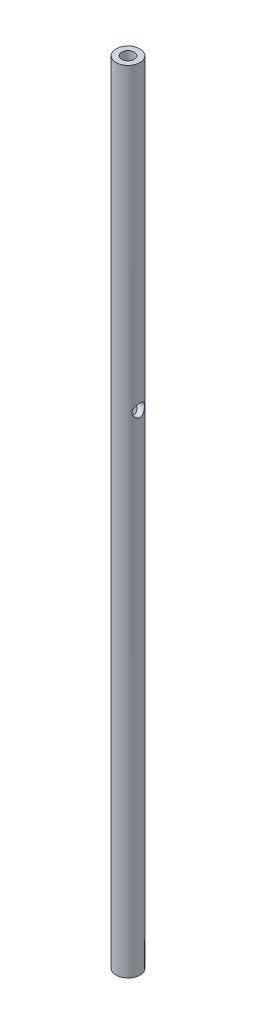
ISO-10303-21;
HEADER;
FILE_DESCRIPTION(('STEP AP214'),'2;1');
FILE_NAME('part.step','',(''),(''),'','','');
FILE_SCHEMA(('AUTOMOTIVE_DESIGN { 1 0 10303 214 1 1 1 1 }'));
ENDSEC;
DATA;
#1=APPLICATION_CONTEXT('core data for automotive mechanical design processes');
#2=APPLICATION_PROTOCOL_DEFINITION('international standard','automotive_design',2000,#1);
#3=PRODUCT_CONTEXT('',#1,'mechanical');
#4=PRODUCT('Part','Part','',(#3));
#5=PRODUCT_RELATED_PRODUCT_CATEGORY('part','',(#4));
#6=PRODUCT_DEFINITION_FORMATION('','',#4);
#7=PRODUCT_DEFINITION_CONTEXT('part definition',#1,'design');
#8=PRODUCT_DEFINITION('design','',#6,#7);
#9=PRODUCT_DEFINITION_SHAPE('','',#8);
#10=(LENGTH_UNIT() NAMED_UNIT(*) SI_UNIT(.MILLI.,.METRE.));
#11=(NAMED_UNIT(*) PLANE_ANGLE_UNIT() SI_UNIT($,.RADIAN.));
#12=(NAMED_UNIT(*) SI_UNIT($,.STERADIAN.) SOLID_ANGLE_UNIT());
#13=UNCERTAINTY_MEASURE_WITH_UNIT(LENGTH_MEASURE(1.E-05),#10,'distance_accuracy_value','');
#14=(GEOMETRIC_REPRESENTATION_CONTEXT(3) GLOBAL_UNCERTAINTY_ASSIGNED_CONTEXT((#13)) GLOBAL_UNIT_ASSIGNED_CONTEXT((#10,
#11,#12)) REPRESENTATION_CONTEXT('',''));
#15=CARTESIAN_POINT('',(0.,0.,0.));
#16=DIRECTION('',(0.,0.,1.));
#17=DIRECTION('',(1.,0.,0.));
#18=AXIS2_PLACEMENT_3D('',#15,#16,#17);
#19=CARTESIAN_POINT('',(0.,-630.,0.));
#20=DIRECTION('',(0.,1.,0.));
#21=DIRECTION('',(-1.,0.,0.));
#22=AXIS2_PLACEMENT_3D('',#19,#20,#21);
#23=CYLINDRICAL_SURFACE('',#22,5.);
#24=CARTESIAN_POINT('',(0.,0.,0.));
#25=DIRECTION('',(0.,1.,0.));
#26=DIRECTION('',(0.,0.,1.));
#27=AXIS2_PLACEMENT_3D('',#24,#25,#26);
#28=CIRCLE('',#27,5.);
#29=CARTESIAN_POINT('',(0.,0.,5.));
#30=VERTEX_POINT('',#29);
#31=EDGE_CURVE('E73',#30,#30,#28,.T.);
#32=ORIENTED_EDGE('',*,*,#31,.T.);
#33=EDGE_LOOP('',(#32));
#34=FACE_BOUND('',#33,.T.);
#35=CARTESIAN_POINT('',(0.,-240.,0.));
#36=DIRECTION('',(-0.707106781186548,0.707106781186547,0.));
#37=DIRECTION('',(0.707106781186547,0.707106781186548,0.));
#38=AXIS2_PLACEMENT_3D('',#35,#36,#37);
#39=ELLIPSE('',#38,7.07106781186548,5.);
#40=CARTESIAN_POINT('',(0.,-240.,-5.00000000000002));
#41=VERTEX_POINT('',#40);
#42=CARTESIAN_POINT('',(0.,-240.,4.99999999999999));
#43=VERTEX_POINT('',#42);
#44=EDGE_CURVE('E57',#41,#43,#39,.F.);
#45=ORIENTED_EDGE('',*,*,#44,.T.);
#46=CARTESIAN_POINT('',(0.,-240.,0.));
#47=DIRECTION('',(0.707106781186547,0.707106781186548,0.));
#48=DIRECTION('',(-0.707106781186548,0.707106781186547,0.));
#49=AXIS2_PLACEMENT_3D('',#46,#47,#48);
#50=ELLIPSE('',#49,7.07106781186548,5.);
#51=EDGE_CURVE('E65',#43,#41,#50,.F.);
#52=ORIENTED_EDGE('',*,*,#51,.T.);
#53=EDGE_LOOP('',(#45,#52));
#54=FACE_BOUND('',#53,.T.);
#55=ADVANCED_FACE('F39',(#34,#54),#23,.F.);
#56=CARTESIAN_POINT('',(0.,-240.,0.));
#57=DIRECTION('',(-0.707106781186548,0.707106781186547,0.));
#58=DIRECTION('',(0.707106781186547,0.707106781186548,0.));
#59=AXIS2_PLACEMENT_3D('',#56,#57,#58);
#60=ELLIPSE('',#59,7.07106781186548,5.);
#61=EDGE_CURVE('E63',#41,#43,#60,.T.);
#62=ORIENTED_EDGE('',*,*,#61,.T.);
#63=CARTESIAN_POINT('',(0.,-240.,0.));
#64=DIRECTION('',(0.707106781186547,0.707106781186548,0.));
#65=DIRECTION('',(-0.707106781186548,0.707106781186547,0.));
#66=AXIS2_PLACEMENT_3D('',#63,#64,#65);
#67=ELLIPSE('',#66,7.07106781186548,5.);
#68=EDGE_CURVE('E68',#43,#41,#67,.T.);
#69=ORIENTED_EDGE('',*,*,#68,.T.);
#70=EDGE_LOOP('',(#62,#69));
#71=FACE_BOUND('',#70,.T.);
#72=CARTESIAN_POINT('',(0.,-630.,0.));
#73=DIRECTION('',(0.,1.,0.));
#74=DIRECTION('',(0.,0.,1.));
#75=AXIS2_PLACEMENT_3D('',#72,#73,#74);
#76=CIRCLE('',#75,5.);
#77=CARTESIAN_POINT('',(0.,-630.,5.));
#78=VERTEX_POINT('',#77);
#79=EDGE_CURVE('E78',#78,#78,#76,.T.);
#80=ORIENTED_EDGE('',*,*,#79,.F.);
#81=EDGE_LOOP('',(#80));
#82=FACE_BOUND('',#81,.T.);
#83=ADVANCED_FACE('F41',(#71,#82),#23,.F.);
#84=CARTESIAN_POINT('',(0.,-630.,0.));
#85=DIRECTION('',(0.,1.,0.));
#86=DIRECTION('',(-1.,0.,0.));
#87=AXIS2_PLACEMENT_3D('',#84,#85,#86);
#88=CYLINDRICAL_SURFACE('',#87,9.5);
#89=CARTESIAN_POINT('',(-9.49999999999997,-245.,0.));
#90=CARTESIAN_POINT('',(-9.50000025830865,-245.000000317987,0.130642017435205));
#91=CARTESIAN_POINT('',(-9.49729937430299,-244.994874460909,0.261280381095527));
#92=CARTESIAN_POINT('',(-9.48656543983488,-244.974434606502,0.521584051797466));
#93=CARTESIAN_POINT('',(-9.47853045078798,-244.959116905127,0.651248987731433));
#94=CARTESIAN_POINT('',(-9.45732130010808,-244.918457771743,0.908724902304485));
#95=CARTESIAN_POINT('',(-9.44414105596155,-244.893104475561,1.03653350028886));
#96=CARTESIAN_POINT('',(-9.41296917939981,-244.832665747286,1.28927680532049));
#97=CARTESIAN_POINT('',(-9.39497558089874,-244.797576338115,1.41421031529786));
#98=CARTESIAN_POINT('',(-9.35470548168466,-244.718228407702,1.65978714859798));
#99=CARTESIAN_POINT('',(-9.33244851287116,-244.674011632829,1.78044717261644));
#100=CARTESIAN_POINT('',(-9.28411689570364,-244.576745504022,2.01738015491989));
#101=CARTESIAN_POINT('',(-9.2580408072228,-244.523692817172,2.13365143738956));
#102=CARTESIAN_POINT('',(-9.17495890241578,-244.352007064426,2.47482405857924));
#103=CARTESIAN_POINT('',(-9.1130560788389,-244.220763507552,2.69233753619867));
#104=CARTESIAN_POINT('',(-8.97711976393959,-243.91892513356,3.11677156857516));
#105=CARTESIAN_POINT('',(-8.90255958431836,-243.746328437928,3.3220871145033));
#106=CARTESIAN_POINT('',(-8.75125016006093,-243.371044573155,3.70237027252014));
#107=CARTESIAN_POINT('',(-8.67449911628702,-243.168332063022,3.87731205508639));
#108=CARTESIAN_POINT('',(-8.51958772864531,-242.716981146188,4.20746485864962));
#109=CARTESIAN_POINT('',(-8.44190043592403,-242.465868784568,4.35957351697893));
#110=CARTESIAN_POINT('',(-8.33771348652019,-242.069721218503,4.55389469941149));
#111=CARTESIAN_POINT('',(-8.30503312029956,-241.934377810615,4.61304200501834));
#112=CARTESIAN_POINT('',(-8.24504198744977,-241.657973245443,4.71942893987687));
#113=CARTESIAN_POINT('',(-8.21772789114387,-241.516915699645,4.76667595821496));
#114=CARTESIAN_POINT('',(-8.17112995464268,-241.238939275689,4.84609400899684));
#115=CARTESIAN_POINT('',(-8.15145552675451,-241.102299485319,4.87901358531858));
#116=CARTESIAN_POINT('',(-8.11871491457939,-240.82602781906,4.93330284979833));
#117=CARTESIAN_POINT('',(-8.1056450322099,-240.686397663325,4.95467900192605));
#118=CARTESIAN_POINT('',(-8.08670284815363,-240.405449346729,4.98553579039542));
#119=CARTESIAN_POINT('',(-8.0808250048411,-240.264132570338,4.99502558557255));
#120=CARTESIAN_POINT('',(-8.07653052575358,-239.981097371673,5.00196707607168));
#121=CARTESIAN_POINT('',(-8.07811303044883,-239.839378997549,4.99942015818054));
#122=CARTESIAN_POINT('',(-8.08793582702384,-239.576240554201,4.98350873638957));
#123=CARTESIAN_POINT('',(-8.09523822735537,-239.454689307969,4.97166766743286));
#124=CARTESIAN_POINT('',(-8.11508625852904,-239.213162077251,4.9392041443369));
#125=CARTESIAN_POINT('',(-8.12763351020944,-239.093186591561,4.91857897557349));
#126=CARTESIAN_POINT('',(-8.15755291872236,-238.855643735992,4.86879569668829));
#127=CARTESIAN_POINT('',(-8.17492474914126,-238.738076203778,4.8396381638284));
#128=CARTESIAN_POINT('',(-8.21394705131996,-238.505999466995,4.773107599323));
#129=CARTESIAN_POINT('',(-8.23559921641884,-238.391491493232,4.73573131560593));
#130=CARTESIAN_POINT('',(-8.30710221321933,-238.048438958685,4.60993727407038));
#131=CARTESIAN_POINT('',(-8.36280226845537,-237.825578256869,4.50895523041276));
#132=CARTESIAN_POINT('',(-8.48371078685145,-237.398963410772,4.27711316444185));
#133=CARTESIAN_POINT('',(-8.54892348767612,-237.195217848662,4.14623981146087));
#134=CARTESIAN_POINT('',(-8.6927207074562,-236.781912537596,3.83663048089169));
#135=CARTESIAN_POINT('',(-8.77188633784792,-236.575663050642,3.65373132820413));
#136=CARTESIAN_POINT('',(-8.92726591590765,-236.19522977888,3.25568322320275));
#137=CARTESIAN_POINT('',(-9.00347812950141,-236.021064613444,3.04051567525197));
#138=CARTESIAN_POINT('',(-9.11199101243249,-235.782926065937,2.69031313449229));
#139=CARTESIAN_POINT('',(-9.14806544000241,-235.705692391911,2.56527566102096));
#140=CARTESIAN_POINT('',(-9.21631266469038,-235.562161069979,2.30808220172624));
#141=CARTESIAN_POINT('',(-9.24848711868113,-235.49585877362,2.17592927355314));
#142=CARTESIAN_POINT('',(-9.30798472722292,-235.374921799144,1.9054127435474));
#143=CARTESIAN_POINT('',(-9.33531009564092,-235.320281794245,1.76705201224454));
#144=CARTESIAN_POINT('',(-9.38429098896261,-235.223320119496,1.48510653814749));
#145=CARTESIAN_POINT('',(-9.40594724572427,-235.180996859531,1.34152247239186));
#146=CARTESIAN_POINT('',(-9.44126093709504,-235.11244534739,1.06324588010183));
#147=CARTESIAN_POINT('',(-9.4554563982781,-235.085124693789,0.92889004006353));
#148=CARTESIAN_POINT('',(-9.47816515752876,-235.041576707566,0.657922734993048));
#149=CARTESIAN_POINT('',(-9.48667903287941,-235.025348247905,0.521311500568225));
#150=CARTESIAN_POINT('',(-9.4977788434464,-235.004213403998,0.247036826142167));
#151=CARTESIAN_POINT('',(-9.50036740785148,-234.999301998122,0.109373880025578));
#152=CARTESIAN_POINT('',(-9.4995486082541,-235.000857572202,-0.165866192071671));
#153=CARTESIAN_POINT('',(-9.49614156915892,-235.007323935586,-0.303443322298616));
#154=CARTESIAN_POINT('',(-9.48399374119529,-235.030470594738,-0.565238510146045));
#155=CARTESIAN_POINT('',(-9.475749573515,-235.046200329972,-0.689565179792616));
#156=CARTESIAN_POINT('',(-9.45455545185438,-235.086862538711,-0.936335078159405));
#157=CARTESIAN_POINT('',(-9.44160402256648,-235.111797897398,-1.05877770384552));
#158=CARTESIAN_POINT('',(-9.4112976808257,-235.170594236761,-1.30090392125638));
#159=CARTESIAN_POINT('',(-9.39394414331217,-235.204452430638,-1.42058836175409));
#160=CARTESIAN_POINT('',(-9.35522364500359,-235.280754206024,-1.6565381014498));
#161=CARTESIAN_POINT('',(-9.33385514435061,-235.32320108203,-1.77280206894136));
#162=CARTESIAN_POINT('',(-9.26321206916049,-235.465241805831,-2.12128187449476));
#163=CARTESIAN_POINT('',(-9.20818884695078,-235.578053684788,-2.34711180990771));
#164=CARTESIAN_POINT('',(-9.08775319789227,-235.834659474917,-2.77719349346293));
#165=CARTESIAN_POINT('',(-9.02233662410059,-235.978465761046,-2.98143657406133));
#166=CARTESIAN_POINT('',(-8.87907718134281,-236.310447906929,-3.38565365206922));
#167=CARTESIAN_POINT('',(-8.80065182943941,-236.501708051263,-3.58289078033242));
#168=CARTESIAN_POINT('',(-8.6448998175482,-236.914427419052,-3.94390985632275));
#169=CARTESIAN_POINT('',(-8.56757417542642,-237.135912834862,-4.10766247641561));
#170=CARTESIAN_POINT('',(-8.45641507034744,-237.495001263268,-4.32972408862327));
#171=CARTESIAN_POINT('',(-8.41915698034218,-237.623378222959,-4.40152563756842));
#172=CARTESIAN_POINT('',(-8.34861864528839,-237.886822288813,-4.53389268372546));
#173=CARTESIAN_POINT('',(-8.31533660459691,-238.021886335709,-4.59446325988693));
#174=CARTESIAN_POINT('',(-8.25405932259667,-238.297776538643,-4.70366120984532));
#175=CARTESIAN_POINT('',(-8.22605934031579,-238.438597388106,-4.75229930567559));
#176=CARTESIAN_POINT('',(-8.17652491174796,-238.725072210172,-4.83702965191856));
#177=CARTESIAN_POINT('',(-8.15498934305151,-238.870725338868,-4.87312408044722));
#178=CARTESIAN_POINT('',(-8.12115384654298,-239.151133826938,-4.92928248767466));
#179=CARTESIAN_POINT('',(-8.10815628985071,-239.285560551181,-4.95056966315999));
#180=CARTESIAN_POINT('',(-8.08880605366263,-239.556169561064,-4.98212437566268));
#181=CARTESIAN_POINT('',(-8.08245250184928,-239.692351613863,-4.99239335930642));
#182=CARTESIAN_POINT('',(-8.07667140831063,-239.96517860929,-5.0017406429867));
#183=CARTESIAN_POINT('',(-8.07724042607815,-240.101823288237,-5.00082450201337));
#184=CARTESIAN_POINT('',(-8.08527049185696,-240.374369067118,-4.98783110526361));
#185=CARTESIAN_POINT('',(-8.0927311275515,-240.510270211048,-4.97575451720255));
#186=CARTESIAN_POINT('',(-8.11296668451022,-240.764438938645,-4.94268112816608));
#187=CARTESIAN_POINT('',(-8.12502408105074,-240.882921992551,-4.92288270134373));
#188=CARTESIAN_POINT('',(-8.15386310324631,-241.117619926702,-4.87496563591164));
#189=CARTESIAN_POINT('',(-8.17064616295861,-241.233834106966,-4.8468444715382));
#190=CARTESIAN_POINT('',(-8.2273374306782,-241.578016944568,-4.75042514444159));
#191=CARTESIAN_POINT('',(-8.27360072536786,-241.801676248189,-4.67005115137985));
#192=CARTESIAN_POINT('',(-8.38148159867353,-242.247024796892,-4.47370477730415));
#193=CARTESIAN_POINT('',(-8.44390522032205,-242.467629417787,-4.35574871260943));
#194=CARTESIAN_POINT('',(-8.57598383248257,-242.887426454723,-4.08956813260782));
#195=CARTESIAN_POINT('',(-8.64564270446488,-243.086607259759,-3.94132732888993));
#196=CARTESIAN_POINT('',(-8.79596127206601,-243.486835400354,-3.59465671755024));
#197=CARTESIAN_POINT('',(-8.87679892021689,-243.684260114576,-3.3921092164831));
#198=CARTESIAN_POINT('',(-9.03177925073255,-244.043428552475,-2.95476621152201));
#199=CARTESIAN_POINT('',(-9.10591775994741,-244.205150124588,-2.71995083317693));
#200=CARTESIAN_POINT('',(-9.20696916784902,-244.418400330676,-2.34500649439868));
#201=CARTESIAN_POINT('',(-9.2392412752377,-244.485130824897,-2.2147574001187));
#202=CARTESIAN_POINT('',(-9.29912751760582,-244.607235065604,-1.94804004206673));
#203=CARTESIAN_POINT('',(-9.32674394512871,-244.662614404526,-1.81157488150005));
#204=CARTESIAN_POINT('',(-9.3764442723001,-244.76125154912,-1.53368303878259));
#205=CARTESIAN_POINT('',(-9.39853950894989,-244.804534215659,-1.39226721478332));
#206=CARTESIAN_POINT('',(-9.43657275939719,-244.878515621948,-1.10544090662377));
#207=CARTESIAN_POINT('',(-9.45251426317006,-244.909221494999,-0.960032736919904));
#208=CARTESIAN_POINT('',(-9.47664083506279,-244.955509446457,-0.679250395972507));
#209=CARTESIAN_POINT('',(-9.48537915156142,-244.972173114994,-0.544101109119837));
#210=CARTESIAN_POINT('',(-9.49705865313696,-244.994418328848,-0.272633236645704));
#211=CARTESIAN_POINT('',(-9.49999973047527,-244.999999668206,-0.136314629340326));
#212=CARTESIAN_POINT('',(-9.49999999999997,-245.,0.));
#213=B_SPLINE_CURVE_WITH_KNOTS('',3,(#89,#90,#91,#92,#93,#94,#95,#96,#97,#98,#99,#100,#101,#102,
#103,#104,#105,#106,#107,#108,#109,#110,#111,#112,#113,#114,#115,#116,#117,#118,#119,#120,#121,
#122,#123,#124,#125,#126,#127,#128,#129,#130,#131,#132,#133,#134,#135,#136,#137,#138,#139,#140,
#141,#142,#143,#144,#145,#146,#147,#148,#149,#150,#151,#152,#153,#154,#155,#156,#157,#158,#159,
#160,#161,#162,#163,#164,#165,#166,#167,#168,#169,#170,#171,#172,#173,#174,#175,#176,#177,#178,
#179,#180,#181,#182,#183,#184,#185,#186,#187,#188,#189,#190,#191,#192,#193,#194,#195,#196,#197,
#198,#199,#200,#201,#202,#203,#204,#205,#206,#207,#208,#209,#210,#211,#212),.UNSPECIFIED.,.T.,
.F.,(4,2,2,2,2,2,2,2,2,2,2,2,2,2,2,2,2,2,2,2,2,2,2,2,2,2,2,2,2,2,2,2,2,2,2,2,2,2,2,2,2,2,2,2,2,
2,2,2,2,2,2,2,2,2,2,2,2,2,2,2,2,4),(0.,0.391792234766466,0.78372693737636,1.17612637938023,
1.56868634813668,1.95948911820484,2.35043963476486,3.13153974791821,3.9633605971163,
4.79588538958415,5.70185853857096,6.1551433399422,6.60814599152594,7.03328551901218,
7.45818673365859,7.88276034589863,8.3072850428954,8.67388499400751,9.04059832088492,
9.40728684329945,9.7741207223621,10.5237287019369,11.2736716402267,12.1305026186323,
12.9878292827807,13.4413063432077,13.8945900672075,14.3476663075089,14.8006840287361,
15.2136370748123,15.6265481560022,16.0392759840608,16.4519814467071,16.8283085214851,
17.2047536431578,17.5810813317143,17.9575536488584,18.729187780622,19.5011305708673,
20.3547282709444,21.2090704279473,21.6637716019806,22.1182666436425,22.5723517866477,
23.0263580416498,23.435929262362,23.8454467021029,24.2547606205802,24.6640500519113,
25.0258225662958,25.3877049832792,26.1110184000081,26.8816169531075,27.6526310629694,
28.5313005688989,29.4105137116298,29.8595817113887,30.3084279316799,30.75634479159,
31.2040072492434,31.6128039120318,32.0216081720173),.UNSPECIFIED.);
#214=CARTESIAN_POINT('',(-9.49999999999997,-245.,0.));
#215=VERTEX_POINT('',#214);
#216=EDGE_CURVE('E11',#215,#215,#213,.T.);
#217=ORIENTED_EDGE('',*,*,#216,.F.);
#218=EDGE_LOOP('',(#217));
#219=FACE_BOUND('',#218,.T.);
#220=CARTESIAN_POINT('',(8.07774721070176,-240.,-5.00000000000003));
#221=CARTESIAN_POINT('',(8.07774702320388,-239.870769543595,-5.00000015702221));
#222=CARTESIAN_POINT('',(8.08085893483679,-239.741540887358,-4.99498330786432));
#223=CARTESIAN_POINT('',(8.09318282554476,-239.484103341995,-4.97499027008854));
#224=CARTESIAN_POINT('',(8.10239721904287,-239.35589487683,-4.96001013952735));
#225=CARTESIAN_POINT('',(8.12658976569262,-239.101374242437,-4.9202723183666));
#226=CARTESIAN_POINT('',(8.14157578718238,-238.975064907573,-4.89550127881135));
#227=CARTESIAN_POINT('',(8.17675428304948,-238.725392462861,-4.83651309219883));
#228=CARTESIAN_POINT('',(8.19694905325429,-238.602030678452,-4.80229177933269));
#229=CARTESIAN_POINT('',(8.26406000519738,-238.239086204738,-4.68650110872775));
#230=CARTESIAN_POINT('',(8.31768676200782,-238.004875099273,-4.59152172272688));
#231=CARTESIAN_POINT('',(8.43661528012329,-237.555909093018,-4.36913467381246));
#232=CARTESIAN_POINT('',(8.50191868459123,-237.341156936951,-4.24172244580949));
#233=CARTESIAN_POINT('',(8.64416219132483,-236.915290192768,-3.94437063492342));
#234=CARTESIAN_POINT('',(8.72162015612497,-236.706326279089,-3.77159767988269));
#235=CARTESIAN_POINT('',(8.87531326774956,-236.31857042822,-3.39414959458652));
#236=CARTESIAN_POINT('',(8.9515477245346,-236.139795010701,-3.18945711448913));
#237=CARTESIAN_POINT('',(9.0623237063983,-235.891260467582,-2.8530239253487));
#238=CARTESIAN_POINT('',(9.09988396161877,-235.80923892481,-2.73115506799545));
#239=CARTESIAN_POINT('',(9.17152938431017,-235.65585945593,-2.47993448871348));
#240=CARTESIAN_POINT('',(9.20561594911389,-235.58449723656,-2.35058580871368));
#241=CARTESIAN_POINT('',(9.26932813109872,-235.453161620285,-2.08522767271898));
#242=CARTESIAN_POINT('',(9.29895509084938,-235.393184794367,-1.9492202377569));
#243=CARTESIAN_POINT('',(9.35286953959171,-235.285304488801,-1.67147554597281));
#244=CARTESIAN_POINT('',(9.37715766833256,-235.237399562481,-1.52973897808202));
#245=CARTESIAN_POINT('',(9.41798402188307,-235.157530988013,-1.25284524318786));
#246=CARTESIAN_POINT('',(9.43497656025179,-235.124620524531,-1.11802784540703));
#247=CARTESIAN_POINT('',(9.46328662384325,-235.070056871155,-0.845552717378584));
#248=CARTESIAN_POINT('',(9.47460477132877,-235.048402446897,-0.707895300296505));
#249=CARTESIAN_POINT('',(9.4912327210024,-235.016659618046,-0.430967393428639));
#250=CARTESIAN_POINT('',(9.49654577795711,-235.006564948012,-0.291697818828001));
#251=CARTESIAN_POINT('',(9.50101557223571,-234.998069263075,-0.012707743436528));
#252=CARTESIAN_POINT('',(9.50017274147638,-234.999667427765,0.127012725030593));
#253=CARTESIAN_POINT('',(9.4927361654581,-235.013812164996,0.392207885237058));
#254=CARTESIAN_POINT('',(9.48670476370808,-235.02528822528,0.517757189154829));
#255=CARTESIAN_POINT('',(9.46978501942793,-235.057630303941,0.767347905350183));
#256=CARTESIAN_POINT('',(9.45889515824082,-235.078499258367,0.891388833676325));
#257=CARTESIAN_POINT('',(9.43251776546065,-235.129387473822,1.13703857618937));
#258=CARTESIAN_POINT('',(9.41703177916739,-235.159403659479,1.25864819318195));
#259=CARTESIAN_POINT('',(9.38182119860157,-235.228267108126,1.49872859401292));
#260=CARTESIAN_POINT('',(9.36209497265746,-235.267117771015,1.61719814976669));
#261=CARTESIAN_POINT('',(9.29666115664045,-235.39742767659,1.96963143626948));
#262=CARTESIAN_POINT('',(9.24501612397304,-235.502051964051,2.1977866057446));
#263=CARTESIAN_POINT('',(9.13042669407046,-235.742555484449,2.6336832919145));
#264=CARTESIAN_POINT('',(9.06747844159925,-235.87844538574,2.84141780612613));
#265=CARTESIAN_POINT('',(8.92849170861259,-236.19343143675,3.25329237874796));
#266=CARTESIAN_POINT('',(8.85177301570154,-236.375516333935,3.45491781588794));
#267=CARTESIAN_POINT('',(8.69770990490254,-236.769970503484,3.82626679284022));
#268=CARTESIAN_POINT('',(8.62036498243435,-236.982367103851,3.99596122113665));
#269=CARTESIAN_POINT('',(8.50705715974576,-237.329199423546,4.22945170723967));
#270=CARTESIAN_POINT('',(8.4684682974886,-237.454382319887,4.30598008243327));
#271=CARTESIAN_POINT('',(8.39469605987028,-237.711746337939,4.44808685051778));
#272=CARTESIAN_POINT('',(8.35951115447979,-237.843924273759,4.51367017275318));
#273=CARTESIAN_POINT('',(8.29384749371141,-238.114497537734,4.63322250991215));
#274=CARTESIAN_POINT('',(8.26336689895266,-238.252890408392,4.68719606750884));
#275=CARTESIAN_POINT('',(8.20836917621802,-238.534931304646,4.7828572942932));
#276=CARTESIAN_POINT('',(8.1838481773349,-238.678575849009,4.8245529420362));
#277=CARTESIAN_POINT('',(8.14356224971427,-238.958276733505,4.89222015762078));
#278=CARTESIAN_POINT('',(8.12725152186515,-239.094013595872,4.91918701144962));
#279=CARTESIAN_POINT('',(8.10130230927554,-239.367818842073,4.96180689416054));
#280=CARTESIAN_POINT('',(8.0916601588788,-239.505885902192,4.97746613894136));
#281=CARTESIAN_POINT('',(8.07947340930436,-239.783086048362,4.99722378698765));
#282=CARTESIAN_POINT('',(8.07692505311374,-239.922218530976,5.00132830987408));
#283=CARTESIAN_POINT('',(8.07903376564123,-240.200277743187,4.99792139513563));
#284=CARTESIAN_POINT('',(8.08369020905161,-240.339204489593,4.99041096557764));
#285=CARTESIAN_POINT('',(8.09894773633863,-240.597854521278,4.96560404425762));
#286=CARTESIAN_POINT('',(8.10871252136867,-240.717761749514,4.94968173241921));
#287=CARTESIAN_POINT('',(8.13321579539658,-240.955628659197,4.90931236190506));
#288=CARTESIAN_POINT('',(8.14795582127267,-241.073587727024,4.8848626689984));
#289=CARTESIAN_POINT('',(8.19896579325719,-241.423401652243,4.79911055705234));
#290=CARTESIAN_POINT('',(8.24203576061463,-241.651348840198,4.72538976317582));
#291=CARTESIAN_POINT('',(8.34365231185429,-242.101671545945,4.54364274775611));
#292=CARTESIAN_POINT('',(8.4028074787917,-242.32333620175,4.43422361218779));
#293=CARTESIAN_POINT('',(8.52950925794946,-242.746510945348,4.18532683529896));
#294=CARTESIAN_POINT('',(8.59706016076947,-242.948010632193,4.04583379788622));
#295=CARTESIAN_POINT('',(8.74448922912082,-243.35516223385,3.71762123591623));
#296=CARTESIAN_POINT('',(8.82475179083306,-243.557310037597,3.5247187894993));
#297=CARTESIAN_POINT('',(8.98045487545702,-243.927700608903,3.10661708770805));
#298=CARTESIAN_POINT('',(9.05589316730656,-244.095927765637,2.88140304325092));
#299=CARTESIAN_POINT('',(9.161038094434,-244.32195021274,2.5183674952263));
#300=CARTESIAN_POINT('',(9.19530646838844,-244.39397704566,2.39052777319169));
#301=CARTESIAN_POINT('',(9.25954250334263,-244.526866555661,2.12816113692369));
#302=CARTESIAN_POINT('',(9.28951208168541,-244.587734213332,1.99363724023041));
#303=CARTESIAN_POINT('',(9.34425197841872,-244.697585545013,1.71888710304818));
#304=CARTESIAN_POINT('',(9.36902509902919,-244.746575626307,1.57866398485331));
#305=CARTESIAN_POINT('',(9.41262353076018,-244.832063382022,1.29356071928364));
#306=CARTESIAN_POINT('',(9.43144964010335,-244.868562733034,1.14868119978111));
#307=CARTESIAN_POINT('',(9.46102735099766,-244.925603581632,0.869862302016339));
#308=CARTESIAN_POINT('',(9.47238729687442,-244.947354089354,0.736233699885349));
#309=CARTESIAN_POINT('',(9.48945614609613,-244.979957064999,0.467299949637954));
#310=CARTESIAN_POINT('',(9.49516556773312,-244.99081053245,0.331994956440782));
#311=CARTESIAN_POINT('',(9.50077217093278,-245.001469015791,0.0608783463641153));
#312=CARTESIAN_POINT('',(9.50067140544412,-245.00127793412,-0.0749330746159266));
#313=CARTESIAN_POINT('',(9.49466621940832,-244.989860713809,-0.345957074729154));
#314=CARTESIAN_POINT('',(9.48876202059201,-244.978634996769,-0.481169676543066));
#315=CARTESIAN_POINT('',(9.47199680163646,-244.946604363455,-0.739377695624846));
#316=CARTESIAN_POINT('',(9.46155888864399,-244.926615989773,-0.862502582213463));
#317=CARTESIAN_POINT('',(9.4361422673272,-244.877623347066,-1.10647965247319));
#318=CARTESIAN_POINT('',(9.42116212873789,-244.848616238131,-1.22733110753329));
#319=CARTESIAN_POINT('',(9.36989356827624,-244.748501649823,-1.58523455467027));
#320=CARTESIAN_POINT('',(9.32726177580294,-244.664272908054,-1.81785679016006));
#321=CARTESIAN_POINT('',(9.22680173609485,-244.460050759565,-2.27443096054653));
#322=CARTESIAN_POINT('',(9.16844575899756,-244.338790861502,-2.49769113612847));
#323=CARTESIAN_POINT('',(9.04230860278756,-244.065468439481,-2.92157316950907));
#324=CARTESIAN_POINT('',(8.97452328154461,-243.913392365085,-3.12218500778252));
#325=CARTESIAN_POINT('',(8.82740658287503,-243.56383858467,-3.51797798706826));
#326=CARTESIAN_POINT('',(8.74761953163941,-243.363228691451,-3.71022243956687));
#327=CARTESIAN_POINT('',(8.59102495973152,-242.931895817988,-4.05968150407758));
#328=CARTESIAN_POINT('',(8.51422065636295,-242.701141432331,-4.21685911344687));
#329=CARTESIAN_POINT('',(8.40616135545196,-242.329916279733,-4.42640533012424));
#330=CARTESIAN_POINT('',(8.37059527350856,-242.198605301709,-4.49310172813767));
#331=CARTESIAN_POINT('',(8.30401573487463,-241.929669434727,-4.61499070268368));
#332=CARTESIAN_POINT('',(8.272999940168,-241.792047836327,-4.67018919320404));
#333=CARTESIAN_POINT('',(8.21684391319764,-241.511730371629,-4.76829848613112));
#334=CARTESIAN_POINT('',(8.19168897991568,-241.369048258826,-4.81124009525068));
#335=CARTESIAN_POINT('',(8.14830390848206,-241.07949571841,-4.88435851540592));
#336=CARTESIAN_POINT('',(8.1300691282228,-240.932628169781,-4.91454388500308));
#337=CARTESIAN_POINT('',(8.10324469523976,-240.65508506308,-4.95862866626085));
#338=CARTESIAN_POINT('',(8.09371736179398,-240.524751252683,-4.97412132729017));
#339=CARTESIAN_POINT('',(8.08096855199783,-240.262944379484,-4.99480718035743));
#340=CARTESIAN_POINT('',(8.07774740145078,-240.131471258173,-4.99999984025516));
#341=CARTESIAN_POINT('',(8.07774721070176,-240.,-5.00000000000003));
#342=B_SPLINE_CURVE_WITH_KNOTS('',3,(#220,#221,#222,#223,#224,#225,#226,#227,#228,#229,#230,
#231,#232,#233,#234,#235,#236,#237,#238,#239,#240,#241,#242,#243,#244,#245,#246,#247,#248,#249,
#250,#251,#252,#253,#254,#255,#256,#257,#258,#259,#260,#261,#262,#263,#264,#265,#266,#267,#268,
#269,#270,#271,#272,#273,#274,#275,#276,#277,#278,#279,#280,#281,#282,#283,#284,#285,#286,#287,
#288,#289,#290,#291,#292,#293,#294,#295,#296,#297,#298,#299,#300,#301,#302,#303,#304,#305,#306,
#307,#308,#309,#310,#311,#312,#313,#314,#315,#316,#317,#318,#319,#320,#321,#322,#323,#324,#325,
#326,#327,#328,#329,#330,#331,#332,#333,#334,#335,#336,#337,#338,#339,#340,#341),.UNSPECIFIED.,
.T.,.F.,(4,2,2,2,2,2,2,2,2,2,2,2,2,2,2,2,2,2,2,2,2,2,2,2,2,2,2,2,2,2,2,2,2,2,2,2,2,2,2,2,2,2,2,
2,2,2,2,2,2,2,2,2,2,2,2,2,2,2,2,2,4),(0.,0.387554261034222,0.775261948070547,1.16350007050006,
1.55190960750983,2.32339352876677,3.09498610045966,3.93753578593819,4.78054504553999,
5.23491853490302,5.68910851966577,6.14316149532709,6.59716003237426,7.01602188783486,
7.43483780018298,7.85342660476232,8.27198604009405,8.65018764270511,9.02850754646993,
9.40670039610694,9.78503903815111,10.5503503493385,11.3159231859611,12.1593629598734,
13.0035680114647,13.4582077254562,13.9126421266656,14.3668983918513,14.8208588128966,
15.238290743834,15.6554930334776,16.0724743225058,16.489419423573,16.8530485047468,
17.2167900158234,17.943808603884,18.7035024248986,19.4635860925027,20.3320401685453,
21.200893013404,21.6524208711034,22.1037467085313,22.5548285366262,23.0058497936446,
23.4128918157186,23.8198964985677,24.2267573728652,24.6336027029,25.0086757592382,
25.3838670421875,26.1335873167377,26.9125410666321,27.6918380829464,28.5554626328682,
29.4199942167182,29.8740037541404,30.3277791904187,30.7804038471411,31.2327243397769,
31.6269782604755,32.0212525494145),.UNSPECIFIED.);
#343=CARTESIAN_POINT('',(8.07774721070176,-240.,-5.00000000000003));
#344=VERTEX_POINT('',#343);
#345=EDGE_CURVE('E51',#344,#344,#342,.T.);
#346=ORIENTED_EDGE('',*,*,#345,.F.);
#347=EDGE_LOOP('',(#346));
#348=FACE_BOUND('',#347,.T.);
#349=CARTESIAN_POINT('',(0.,-630.,0.));
#350=DIRECTION('',(0.,1.,0.));
#351=DIRECTION('',(0.,0.,1.));
#352=AXIS2_PLACEMENT_3D('',#349,#350,#351);
#353=CIRCLE('',#352,9.5);
#354=CARTESIAN_POINT('',(0.,-630.,9.5));
#355=VERTEX_POINT('',#354);
#356=EDGE_CURVE('E81',#355,#355,#353,.T.);
#357=ORIENTED_EDGE('',*,*,#356,.T.);
#358=EDGE_LOOP('',(#357));
#359=FACE_BOUND('',#358,.T.);
#360=CARTESIAN_POINT('',(0.,0.,0.));
#361=DIRECTION('',(0.,1.,0.));
#362=DIRECTION('',(0.,0.,1.));
#363=AXIS2_PLACEMENT_3D('',#360,#361,#362);
#364=CIRCLE('',#363,9.5);
#365=CARTESIAN_POINT('',(0.,0.,9.5));
#366=VERTEX_POINT('',#365);
#367=EDGE_CURVE('E82',#366,#366,#364,.T.);
#368=ORIENTED_EDGE('',*,*,#367,.F.);
#369=EDGE_LOOP('',(#368));
#370=FACE_BOUND('',#369,.T.);
#371=ADVANCED_FACE('F92',(#219,#348,#359,#370),#88,.T.);
#372=CARTESIAN_POINT('',(0.,-630.,0.));
#373=DIRECTION('',(0.,1.,0.));
#374=DIRECTION('',(0.,0.,1.));
#375=AXIS2_PLACEMENT_3D('',#372,#373,#374);
#376=PLANE('',#375);
#377=ORIENTED_EDGE('',*,*,#79,.T.);
#378=EDGE_LOOP('',(#377));
#379=FACE_BOUND('',#378,.T.);
#380=ORIENTED_EDGE('',*,*,#356,.F.);
#381=EDGE_LOOP('',(#380));
#382=FACE_BOUND('',#381,.T.);
#383=ADVANCED_FACE('F99',(#379,#382),#376,.F.);
#384=CARTESIAN_POINT('',(0.,0.,0.));
#385=DIRECTION('',(0.,1.,0.));
#386=DIRECTION('',(0.,0.,1.));
#387=AXIS2_PLACEMENT_3D('',#384,#385,#386);
#388=PLANE('',#387);
#389=ORIENTED_EDGE('',*,*,#31,.F.);
#390=EDGE_LOOP('',(#389));
#391=FACE_BOUND('',#390,.T.);
#392=ORIENTED_EDGE('',*,*,#367,.T.);
#393=EDGE_LOOP('',(#392));
#394=FACE_BOUND('',#393,.T.);
#395=ADVANCED_FACE('F102',(#391,#394),#388,.T.);
#396=CARTESIAN_POINT('',(-9.5,-240.,0.));
#397=DIRECTION('',(1.,0.,0.));
#398=DIRECTION('',(0.,0.,-1.));
#399=AXIS2_PLACEMENT_3D('',#396,#397,#398);
#400=CYLINDRICAL_SURFACE('',#399,5.);
#401=ORIENTED_EDGE('',*,*,#345,.T.);
#402=EDGE_LOOP('',(#401));
#403=FACE_BOUND('',#402,.T.);
#404=ORIENTED_EDGE('',*,*,#44,.F.);
#405=ORIENTED_EDGE('',*,*,#68,.F.);
#406=EDGE_LOOP('',(#404,#405));
#407=FACE_BOUND('',#406,.T.);
#408=ADVANCED_FACE('F71',(#403,#407),#400,.F.);
#409=ORIENTED_EDGE('',*,*,#216,.T.);
#410=EDGE_LOOP('',(#409));
#411=FACE_BOUND('',#410,.T.);
#412=ORIENTED_EDGE('',*,*,#61,.F.);
#413=ORIENTED_EDGE('',*,*,#51,.F.);
#414=EDGE_LOOP('',(#412,#413));
#415=FACE_BOUND('',#414,.T.);
#416=ADVANCED_FACE('F64',(#411,#415),#400,.F.);
#417=CLOSED_SHELL('',(#55,#83,#371,#383,#395,#408,#416));
#418=MANIFOLD_SOLID_BREP('B2',#417);
#419=ADVANCED_BREP_SHAPE_REPRESENTATION('',(#18,#418),#14);
#420=SHAPE_DEFINITION_REPRESENTATION(#9,#419);
ENDSEC;
END-ISO-10303-21;
